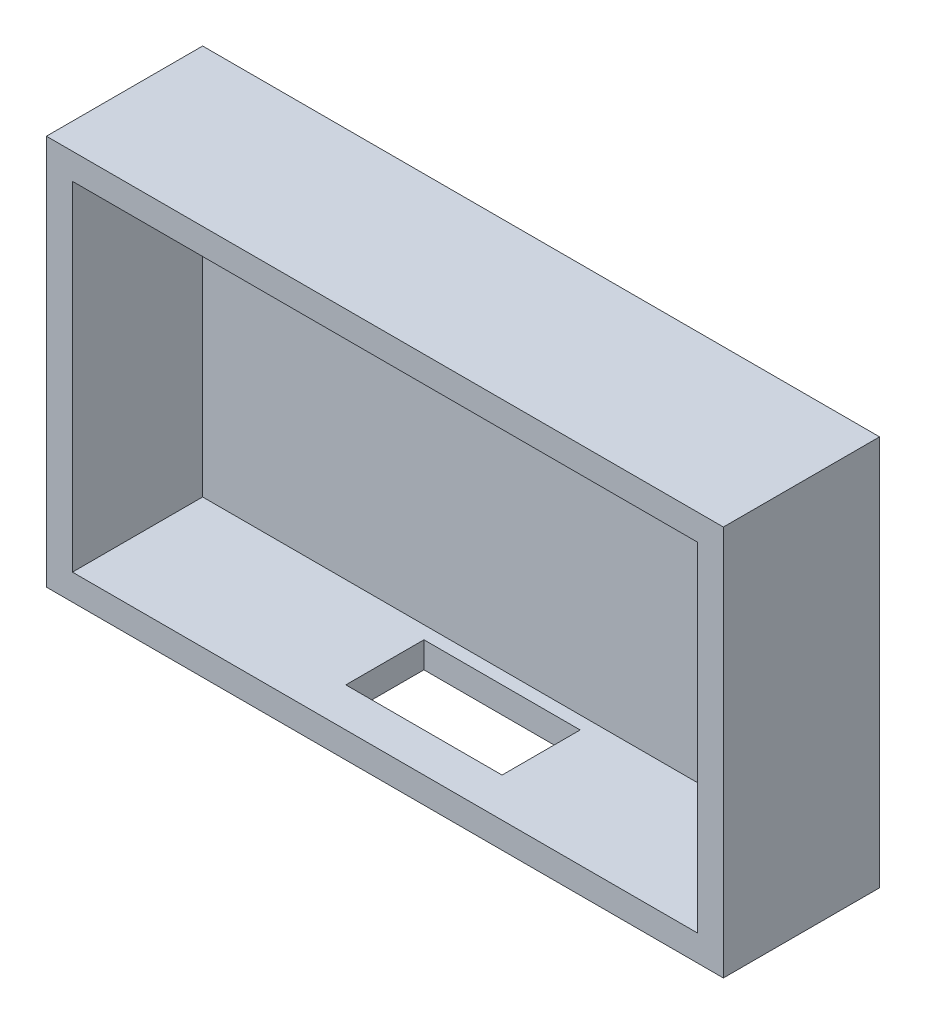
ISO-10303-21;
HEADER;
FILE_DESCRIPTION(('STEP AP214'),'2;1');
FILE_NAME('part.step','',(''),(''),'','','');
FILE_SCHEMA(('AUTOMOTIVE_DESIGN { 1 0 10303 214 1 1 1 1 }'));
ENDSEC;
DATA;
#1=APPLICATION_CONTEXT('core data for automotive mechanical design processes');
#2=APPLICATION_PROTOCOL_DEFINITION('international standard','automotive_design',2000,#1);
#3=PRODUCT_CONTEXT('',#1,'mechanical');
#4=PRODUCT('Part','Part','',(#3));
#5=PRODUCT_RELATED_PRODUCT_CATEGORY('part','',(#4));
#6=PRODUCT_DEFINITION_FORMATION('','',#4);
#7=PRODUCT_DEFINITION_CONTEXT('part definition',#1,'design');
#8=PRODUCT_DEFINITION('design','',#6,#7);
#9=PRODUCT_DEFINITION_SHAPE('','',#8);
#10=(LENGTH_UNIT() NAMED_UNIT(*) SI_UNIT(.MILLI.,.METRE.));
#11=(NAMED_UNIT(*) PLANE_ANGLE_UNIT() SI_UNIT($,.RADIAN.));
#12=(NAMED_UNIT(*) SI_UNIT($,.STERADIAN.) SOLID_ANGLE_UNIT());
#13=UNCERTAINTY_MEASURE_WITH_UNIT(LENGTH_MEASURE(1.E-05),#10,'distance_accuracy_value','');
#14=(GEOMETRIC_REPRESENTATION_CONTEXT(3) GLOBAL_UNCERTAINTY_ASSIGNED_CONTEXT((#13)) GLOBAL_UNIT_ASSIGNED_CONTEXT((#10,
#11,#12)) REPRESENTATION_CONTEXT('',''));
#15=CARTESIAN_POINT('',(0.,0.,0.));
#16=DIRECTION('',(0.,0.,1.));
#17=DIRECTION('',(1.,0.,0.));
#18=AXIS2_PLACEMENT_3D('',#15,#16,#17);
#19=CARTESIAN_POINT('',(0.,75.,0.));
#20=DIRECTION('',(0.,0.,-1.));
#21=DIRECTION('',(-1.,0.,0.));
#22=AXIS2_PLACEMENT_3D('',#19,#20,#21);
#23=PLANE('',#22);
#24=DIRECTION('',(1.,0.,0.));
#25=VECTOR('',#24,1.);
#26=CARTESIAN_POINT('',(0.,0.,0.));
#27=LINE('',#26,#25);
#28=CARTESIAN_POINT('',(0.,0.,0.));
#29=VERTEX_POINT('',#28);
#30=CARTESIAN_POINT('',(130.,0.,0.));
#31=VERTEX_POINT('',#30);
#32=EDGE_CURVE('E194',#29,#31,#27,.T.);
#33=ORIENTED_EDGE('',*,*,#32,.T.);
#34=DIRECTION('',(0.,-1.,0.));
#35=VECTOR('',#34,1.);
#36=CARTESIAN_POINT('',(130.,75.,0.));
#37=LINE('',#36,#35);
#38=CARTESIAN_POINT('',(130.,75.,0.));
#39=VERTEX_POINT('',#38);
#40=EDGE_CURVE('E40',#39,#31,#37,.T.);
#41=ORIENTED_EDGE('',*,*,#40,.F.);
#42=DIRECTION('',(1.,0.,0.));
#43=VECTOR('',#42,1.);
#44=CARTESIAN_POINT('',(0.,75.,0.));
#45=LINE('',#44,#43);
#46=CARTESIAN_POINT('',(0.,75.,0.));
#47=VERTEX_POINT('',#46);
#48=EDGE_CURVE('E184',#47,#39,#45,.T.);
#49=ORIENTED_EDGE('',*,*,#48,.F.);
#50=DIRECTION('',(0.,-1.,0.));
#51=VECTOR('',#50,1.);
#52=CARTESIAN_POINT('',(0.,75.,0.));
#53=LINE('',#52,#51);
#54=EDGE_CURVE('E11',#47,#29,#53,.T.);
#55=ORIENTED_EDGE('',*,*,#54,.T.);
#56=EDGE_LOOP('',(#33,#41,#49,#55));
#57=FACE_BOUND('',#56,.T.);
#58=DIRECTION('',(1.,0.,0.));
#59=VECTOR('',#58,1.);
#60=CARTESIAN_POINT('',(0.,5.,0.));
#61=LINE('',#60,#59);
#62=CARTESIAN_POINT('',(5.,5.,0.));
#63=VERTEX_POINT('',#62);
#64=CARTESIAN_POINT('',(125.,5.,0.));
#65=VERTEX_POINT('',#64);
#66=EDGE_CURVE('E154',#63,#65,#61,.T.);
#67=ORIENTED_EDGE('',*,*,#66,.F.);
#68=DIRECTION('',(0.,-1.,0.));
#69=VECTOR('',#68,1.);
#70=CARTESIAN_POINT('',(5.,75.,0.));
#71=LINE('',#70,#69);
#72=CARTESIAN_POINT('',(5.,70.,0.));
#73=VERTEX_POINT('',#72);
#74=EDGE_CURVE('E173',#73,#63,#71,.T.);
#75=ORIENTED_EDGE('',*,*,#74,.F.);
#76=DIRECTION('',(1.,0.,0.));
#77=VECTOR('',#76,1.);
#78=CARTESIAN_POINT('',(0.,70.,0.));
#79=LINE('',#78,#77);
#80=CARTESIAN_POINT('',(125.,70.,0.));
#81=VERTEX_POINT('',#80);
#82=EDGE_CURVE('E157',#73,#81,#79,.T.);
#83=ORIENTED_EDGE('',*,*,#82,.T.);
#84=DIRECTION('',(0.,-1.,0.));
#85=VECTOR('',#84,1.);
#86=CARTESIAN_POINT('',(125.,75.,0.));
#87=LINE('',#86,#85);
#88=EDGE_CURVE('E170',#81,#65,#87,.T.);
#89=ORIENTED_EDGE('',*,*,#88,.T.);
#90=EDGE_LOOP('',(#67,#75,#83,#89));
#91=FACE_BOUND('',#90,.T.);
#92=ADVANCED_FACE('F32',(#57,#91),#23,.F.);
#93=CARTESIAN_POINT('',(0.,75.,0.));
#94=DIRECTION('',(1.,0.,0.));
#95=DIRECTION('',(0.,0.,-1.));
#96=AXIS2_PLACEMENT_3D('',#93,#94,#95);
#97=PLANE('',#96);
#98=DIRECTION('',(0.,0.,1.));
#99=VECTOR('',#98,1.);
#100=CARTESIAN_POINT('',(0.,0.,0.));
#101=LINE('',#100,#99);
#102=CARTESIAN_POINT('',(0.,0.,-30.));
#103=VERTEX_POINT('',#102);
#104=EDGE_CURVE('E175',#103,#29,#101,.T.);
#105=ORIENTED_EDGE('',*,*,#104,.T.);
#106=ORIENTED_EDGE('',*,*,#54,.F.);
#107=DIRECTION('',(0.,0.,1.));
#108=VECTOR('',#107,1.);
#109=CARTESIAN_POINT('',(0.,75.,0.));
#110=LINE('',#109,#108);
#111=CARTESIAN_POINT('',(0.,75.,-30.));
#112=VERTEX_POINT('',#111);
#113=EDGE_CURVE('E181',#112,#47,#110,.T.);
#114=ORIENTED_EDGE('',*,*,#113,.F.);
#115=DIRECTION('',(0.,-1.,0.));
#116=VECTOR('',#115,1.);
#117=CARTESIAN_POINT('',(0.,75.,-30.));
#118=LINE('',#117,#116);
#119=EDGE_CURVE('E191',#112,#103,#118,.T.);
#120=ORIENTED_EDGE('',*,*,#119,.T.);
#121=EDGE_LOOP('',(#105,#106,#114,#120));
#122=FACE_BOUND('',#121,.T.);
#123=ADVANCED_FACE('F34',(#122),#97,.F.);
#124=CARTESIAN_POINT('',(130.,75.,0.));
#125=DIRECTION('',(-1.,0.,0.));
#126=DIRECTION('',(0.,0.,1.));
#127=AXIS2_PLACEMENT_3D('',#124,#125,#126);
#128=PLANE('',#127);
#129=DIRECTION('',(0.,0.,-1.));
#130=VECTOR('',#129,1.);
#131=CARTESIAN_POINT('',(130.,0.,0.));
#132=LINE('',#131,#130);
#133=CARTESIAN_POINT('',(130.,0.,-30.));
#134=VERTEX_POINT('',#133);
#135=EDGE_CURVE('E196',#31,#134,#132,.T.);
#136=ORIENTED_EDGE('',*,*,#135,.T.);
#137=DIRECTION('',(0.,-1.,0.));
#138=VECTOR('',#137,1.);
#139=CARTESIAN_POINT('',(130.,75.,-30.));
#140=LINE('',#139,#138);
#141=CARTESIAN_POINT('',(130.,75.,-30.));
#142=VERTEX_POINT('',#141);
#143=EDGE_CURVE('E201',#142,#134,#140,.T.);
#144=ORIENTED_EDGE('',*,*,#143,.F.);
#145=DIRECTION('',(0.,0.,-1.));
#146=VECTOR('',#145,1.);
#147=CARTESIAN_POINT('',(130.,75.,0.));
#148=LINE('',#147,#146);
#149=EDGE_CURVE('E187',#39,#142,#148,.T.);
#150=ORIENTED_EDGE('',*,*,#149,.F.);
#151=ORIENTED_EDGE('',*,*,#40,.T.);
#152=EDGE_LOOP('',(#136,#144,#150,#151));
#153=FACE_BOUND('',#152,.T.);
#154=ADVANCED_FACE('F208',(#153),#128,.F.);
#155=CARTESIAN_POINT('',(0.,75.,-30.));
#156=DIRECTION('',(0.,0.,1.));
#157=DIRECTION('',(1.,0.,0.));
#158=AXIS2_PLACEMENT_3D('',#155,#156,#157);
#159=PLANE('',#158);
#160=DIRECTION('',(-1.,0.,0.));
#161=VECTOR('',#160,1.);
#162=CARTESIAN_POINT('',(0.,0.,-30.));
#163=LINE('',#162,#161);
#164=EDGE_CURVE('E185',#134,#103,#163,.T.);
#165=ORIENTED_EDGE('',*,*,#164,.T.);
#166=ORIENTED_EDGE('',*,*,#119,.F.);
#167=DIRECTION('',(-1.,0.,0.));
#168=VECTOR('',#167,1.);
#169=CARTESIAN_POINT('',(0.,75.,-30.));
#170=LINE('',#169,#168);
#171=EDGE_CURVE('E189',#142,#112,#170,.T.);
#172=ORIENTED_EDGE('',*,*,#171,.F.);
#173=ORIENTED_EDGE('',*,*,#143,.T.);
#174=EDGE_LOOP('',(#165,#166,#172,#173));
#175=FACE_BOUND('',#174,.T.);
#176=ADVANCED_FACE('F215',(#175),#159,.F.);
#177=CARTESIAN_POINT('',(0.,75.,0.));
#178=DIRECTION('',(0.,-1.,0.));
#179=DIRECTION('',(0.,0.,-1.));
#180=AXIS2_PLACEMENT_3D('',#177,#178,#179);
#181=PLANE('',#180);
#182=ORIENTED_EDGE('',*,*,#113,.T.);
#183=ORIENTED_EDGE('',*,*,#48,.T.);
#184=ORIENTED_EDGE('',*,*,#149,.T.);
#185=ORIENTED_EDGE('',*,*,#171,.T.);
#186=EDGE_LOOP('',(#182,#183,#184,#185));
#187=FACE_BOUND('',#186,.T.);
#188=ADVANCED_FACE('F221',(#187),#181,.F.);
#189=CARTESIAN_POINT('',(0.,0.,0.));
#190=DIRECTION('',(0.,-1.,0.));
#191=DIRECTION('',(0.,0.,-1.));
#192=AXIS2_PLACEMENT_3D('',#189,#190,#191);
#193=PLANE('',#192);
#194=DIRECTION('',(-1.,0.,0.));
#195=VECTOR('',#194,1.);
#196=CARTESIAN_POINT('',(50.,0.,-7.5));
#197=LINE('',#196,#195);
#198=CARTESIAN_POINT('',(80.,0.,-7.5));
#199=VERTEX_POINT('',#198);
#200=CARTESIAN_POINT('',(50.,0.,-7.5));
#201=VERTEX_POINT('',#200);
#202=EDGE_CURVE('E123',#199,#201,#197,.T.);
#203=ORIENTED_EDGE('',*,*,#202,.F.);
#204=DIRECTION('',(0.,0.,1.));
#205=VECTOR('',#204,1.);
#206=CARTESIAN_POINT('',(80.,0.,-22.5));
#207=LINE('',#206,#205);
#208=CARTESIAN_POINT('',(80.,0.,-22.5));
#209=VERTEX_POINT('',#208);
#210=EDGE_CURVE('E131',#209,#199,#207,.T.);
#211=ORIENTED_EDGE('',*,*,#210,.F.);
#212=DIRECTION('',(1.,0.,0.));
#213=VECTOR('',#212,1.);
#214=CARTESIAN_POINT('',(50.,0.,-22.5));
#215=LINE('',#214,#213);
#216=CARTESIAN_POINT('',(50.,0.,-22.5));
#217=VERTEX_POINT('',#216);
#218=EDGE_CURVE('E47',#217,#209,#215,.T.);
#219=ORIENTED_EDGE('',*,*,#218,.F.);
#220=DIRECTION('',(0.,0.,-1.));
#221=VECTOR('',#220,1.);
#222=CARTESIAN_POINT('',(50.,0.,-22.5));
#223=LINE('',#222,#221);
#224=EDGE_CURVE('E140',#201,#217,#223,.T.);
#225=ORIENTED_EDGE('',*,*,#224,.F.);
#226=EDGE_LOOP('',(#203,#211,#219,#225));
#227=FACE_BOUND('',#226,.T.);
#228=ORIENTED_EDGE('',*,*,#104,.F.);
#229=ORIENTED_EDGE('',*,*,#164,.F.);
#230=ORIENTED_EDGE('',*,*,#135,.F.);
#231=ORIENTED_EDGE('',*,*,#32,.F.);
#232=EDGE_LOOP('',(#228,#229,#230,#231));
#233=FACE_BOUND('',#232,.T.);
#234=ADVANCED_FACE('F137',(#227,#233),#193,.T.);
#235=CARTESIAN_POINT('',(5.,75.,0.));
#236=DIRECTION('',(1.,0.,0.));
#237=DIRECTION('',(0.,0.,-1.));
#238=AXIS2_PLACEMENT_3D('',#235,#236,#237);
#239=PLANE('',#238);
#240=DIRECTION('',(0.,0.,1.));
#241=VECTOR('',#240,1.);
#242=CARTESIAN_POINT('',(5.,5.,0.));
#243=LINE('',#242,#241);
#244=CARTESIAN_POINT('',(5.,5.,-25.));
#245=VERTEX_POINT('',#244);
#246=EDGE_CURVE('E151',#245,#63,#243,.T.);
#247=ORIENTED_EDGE('',*,*,#246,.F.);
#248=DIRECTION('',(0.,-1.,0.));
#249=VECTOR('',#248,1.);
#250=CARTESIAN_POINT('',(5.,75.,-25.));
#251=LINE('',#250,#249);
#252=CARTESIAN_POINT('',(5.,70.,-25.));
#253=VERTEX_POINT('',#252);
#254=EDGE_CURVE('E159',#253,#245,#251,.T.);
#255=ORIENTED_EDGE('',*,*,#254,.F.);
#256=DIRECTION('',(0.,0.,1.));
#257=VECTOR('',#256,1.);
#258=CARTESIAN_POINT('',(5.,70.,0.));
#259=LINE('',#258,#257);
#260=EDGE_CURVE('E155',#253,#73,#259,.T.);
#261=ORIENTED_EDGE('',*,*,#260,.T.);
#262=ORIENTED_EDGE('',*,*,#74,.T.);
#263=EDGE_LOOP('',(#247,#255,#261,#262));
#264=FACE_BOUND('',#263,.T.);
#265=ADVANCED_FACE('F241',(#264),#239,.T.);
#266=CARTESIAN_POINT('',(125.,75.,0.));
#267=DIRECTION('',(-1.,0.,0.));
#268=DIRECTION('',(0.,0.,1.));
#269=AXIS2_PLACEMENT_3D('',#266,#267,#268);
#270=PLANE('',#269);
#271=DIRECTION('',(0.,0.,-1.));
#272=VECTOR('',#271,1.);
#273=CARTESIAN_POINT('',(125.,5.,0.));
#274=LINE('',#273,#272);
#275=CARTESIAN_POINT('',(125.,5.,-25.));
#276=VERTEX_POINT('',#275);
#277=EDGE_CURVE('E165',#65,#276,#274,.T.);
#278=ORIENTED_EDGE('',*,*,#277,.F.);
#279=ORIENTED_EDGE('',*,*,#88,.F.);
#280=DIRECTION('',(0.,0.,-1.));
#281=VECTOR('',#280,1.);
#282=CARTESIAN_POINT('',(125.,70.,0.));
#283=LINE('',#282,#281);
#284=CARTESIAN_POINT('',(125.,70.,-25.));
#285=VERTEX_POINT('',#284);
#286=EDGE_CURVE('E167',#81,#285,#283,.T.);
#287=ORIENTED_EDGE('',*,*,#286,.T.);
#288=DIRECTION('',(0.,-1.,0.));
#289=VECTOR('',#288,1.);
#290=CARTESIAN_POINT('',(125.,75.,-25.));
#291=LINE('',#290,#289);
#292=EDGE_CURVE('E162',#285,#276,#291,.T.);
#293=ORIENTED_EDGE('',*,*,#292,.T.);
#294=EDGE_LOOP('',(#278,#279,#287,#293));
#295=FACE_BOUND('',#294,.T.);
#296=ADVANCED_FACE('F231',(#295),#270,.T.);
#297=CARTESIAN_POINT('',(0.,75.,-25.));
#298=DIRECTION('',(0.,0.,1.));
#299=DIRECTION('',(1.,0.,0.));
#300=AXIS2_PLACEMENT_3D('',#297,#298,#299);
#301=PLANE('',#300);
#302=DIRECTION('',(-1.,0.,0.));
#303=VECTOR('',#302,1.);
#304=CARTESIAN_POINT('',(0.,5.,-25.));
#305=LINE('',#304,#303);
#306=EDGE_CURVE('E158',#276,#245,#305,.T.);
#307=ORIENTED_EDGE('',*,*,#306,.F.);
#308=ORIENTED_EDGE('',*,*,#292,.F.);
#309=DIRECTION('',(-1.,0.,0.));
#310=VECTOR('',#309,1.);
#311=CARTESIAN_POINT('',(0.,70.,-25.));
#312=LINE('',#311,#310);
#313=EDGE_CURVE('E163',#285,#253,#312,.T.);
#314=ORIENTED_EDGE('',*,*,#313,.T.);
#315=ORIENTED_EDGE('',*,*,#254,.T.);
#316=EDGE_LOOP('',(#307,#308,#314,#315));
#317=FACE_BOUND('',#316,.T.);
#318=ADVANCED_FACE('F237',(#317),#301,.T.);
#319=CARTESIAN_POINT('',(0.,70.,0.));
#320=DIRECTION('',(0.,-1.,0.));
#321=DIRECTION('',(0.,0.,-1.));
#322=AXIS2_PLACEMENT_3D('',#319,#320,#321);
#323=PLANE('',#322);
#324=ORIENTED_EDGE('',*,*,#260,.F.);
#325=ORIENTED_EDGE('',*,*,#313,.F.);
#326=ORIENTED_EDGE('',*,*,#286,.F.);
#327=ORIENTED_EDGE('',*,*,#82,.F.);
#328=EDGE_LOOP('',(#324,#325,#326,#327));
#329=FACE_BOUND('',#328,.T.);
#330=ADVANCED_FACE('F244',(#329),#323,.T.);
#331=CARTESIAN_POINT('',(0.,5.,0.));
#332=DIRECTION('',(0.,-1.,0.));
#333=DIRECTION('',(0.,0.,-1.));
#334=AXIS2_PLACEMENT_3D('',#331,#332,#333);
#335=PLANE('',#334);
#336=DIRECTION('',(0.,0.,-1.));
#337=VECTOR('',#336,1.);
#338=CARTESIAN_POINT('',(80.,5.,-22.5));
#339=LINE('',#338,#337);
#340=CARTESIAN_POINT('',(80.,5.,-7.5));
#341=VERTEX_POINT('',#340);
#342=CARTESIAN_POINT('',(80.,5.,-22.5));
#343=VERTEX_POINT('',#342);
#344=EDGE_CURVE('E135',#341,#343,#339,.T.);
#345=ORIENTED_EDGE('',*,*,#344,.F.);
#346=DIRECTION('',(1.,0.,0.));
#347=VECTOR('',#346,1.);
#348=CARTESIAN_POINT('',(50.,5.,-7.5));
#349=LINE('',#348,#347);
#350=CARTESIAN_POINT('',(50.,5.,-7.5));
#351=VERTEX_POINT('',#350);
#352=EDGE_CURVE('E55',#351,#341,#349,.T.);
#353=ORIENTED_EDGE('',*,*,#352,.F.);
#354=DIRECTION('',(0.,0.,1.));
#355=VECTOR('',#354,1.);
#356=CARTESIAN_POINT('',(50.,5.,-22.5));
#357=LINE('',#356,#355);
#358=CARTESIAN_POINT('',(50.,5.,-22.5));
#359=VERTEX_POINT('',#358);
#360=EDGE_CURVE('E356',#359,#351,#357,.T.);
#361=ORIENTED_EDGE('',*,*,#360,.F.);
#362=DIRECTION('',(-1.,0.,0.));
#363=VECTOR('',#362,1.);
#364=CARTESIAN_POINT('',(50.,5.,-22.5));
#365=LINE('',#364,#363);
#366=EDGE_CURVE('E354',#343,#359,#365,.T.);
#367=ORIENTED_EDGE('',*,*,#366,.F.);
#368=EDGE_LOOP('',(#345,#353,#361,#367));
#369=FACE_BOUND('',#368,.T.);
#370=ORIENTED_EDGE('',*,*,#246,.T.);
#371=ORIENTED_EDGE('',*,*,#66,.T.);
#372=ORIENTED_EDGE('',*,*,#277,.T.);
#373=ORIENTED_EDGE('',*,*,#306,.T.);
#374=EDGE_LOOP('',(#370,#371,#372,#373));
#375=FACE_BOUND('',#374,.T.);
#376=ADVANCED_FACE('F228',(#369,#375),#335,.F.);
#377=CARTESIAN_POINT('',(50.,75.001,-7.5));
#378=DIRECTION('',(0.,0.,1.));
#379=DIRECTION('',(1.,0.,0.));
#380=AXIS2_PLACEMENT_3D('',#377,#378,#379);
#381=PLANE('',#380);
#382=ORIENTED_EDGE('',*,*,#352,.T.);
#383=DIRECTION('',(0.,-1.,0.));
#384=VECTOR('',#383,1.);
#385=CARTESIAN_POINT('',(80.,75.001,-7.5));
#386=LINE('',#385,#384);
#387=EDGE_CURVE('E119',#341,#199,#386,.T.);
#388=ORIENTED_EDGE('',*,*,#387,.T.);
#389=ORIENTED_EDGE('',*,*,#202,.T.);
#390=DIRECTION('',(0.,-1.,0.));
#391=VECTOR('',#390,1.);
#392=CARTESIAN_POINT('',(50.,75.001,-7.5));
#393=LINE('',#392,#391);
#394=EDGE_CURVE('E128',#351,#201,#393,.T.);
#395=ORIENTED_EDGE('',*,*,#394,.F.);
#396=EDGE_LOOP('',(#382,#388,#389,#395));
#397=FACE_BOUND('',#396,.T.);
#398=ADVANCED_FACE('F121',(#397),#381,.F.);
#399=CARTESIAN_POINT('',(50.,75.001,-22.5));
#400=DIRECTION('',(-1.,0.,0.));
#401=DIRECTION('',(0.,0.,1.));
#402=AXIS2_PLACEMENT_3D('',#399,#400,#401);
#403=PLANE('',#402);
#404=ORIENTED_EDGE('',*,*,#360,.T.);
#405=ORIENTED_EDGE('',*,*,#394,.T.);
#406=ORIENTED_EDGE('',*,*,#224,.T.);
#407=DIRECTION('',(0.,-1.,0.));
#408=VECTOR('',#407,1.);
#409=CARTESIAN_POINT('',(50.,75.001,-22.5));
#410=LINE('',#409,#408);
#411=EDGE_CURVE('E147',#359,#217,#410,.T.);
#412=ORIENTED_EDGE('',*,*,#411,.F.);
#413=EDGE_LOOP('',(#404,#405,#406,#412));
#414=FACE_BOUND('',#413,.T.);
#415=ADVANCED_FACE('F322',(#414),#403,.F.);
#416=CARTESIAN_POINT('',(50.,75.001,-22.5));
#417=DIRECTION('',(0.,0.,-1.));
#418=DIRECTION('',(-1.,0.,0.));
#419=AXIS2_PLACEMENT_3D('',#416,#417,#418);
#420=PLANE('',#419);
#421=ORIENTED_EDGE('',*,*,#366,.T.);
#422=ORIENTED_EDGE('',*,*,#411,.T.);
#423=ORIENTED_EDGE('',*,*,#218,.T.);
#424=DIRECTION('',(0.,-1.,0.));
#425=VECTOR('',#424,1.);
#426=CARTESIAN_POINT('',(80.,75.001,-22.5));
#427=LINE('',#426,#425);
#428=EDGE_CURVE('E133',#343,#209,#427,.T.);
#429=ORIENTED_EDGE('',*,*,#428,.F.);
#430=EDGE_LOOP('',(#421,#422,#423,#429));
#431=FACE_BOUND('',#430,.T.);
#432=ADVANCED_FACE('F331',(#431),#420,.F.);
#433=CARTESIAN_POINT('',(80.,75.001,-22.5));
#434=DIRECTION('',(1.,0.,0.));
#435=DIRECTION('',(0.,0.,-1.));
#436=AXIS2_PLACEMENT_3D('',#433,#434,#435);
#437=PLANE('',#436);
#438=ORIENTED_EDGE('',*,*,#344,.T.);
#439=ORIENTED_EDGE('',*,*,#428,.T.);
#440=ORIENTED_EDGE('',*,*,#210,.T.);
#441=ORIENTED_EDGE('',*,*,#387,.F.);
#442=EDGE_LOOP('',(#438,#439,#440,#441));
#443=FACE_BOUND('',#442,.T.);
#444=ADVANCED_FACE('F132',(#443),#437,.F.);
#445=CLOSED_SHELL('',(#92,#123,#154,#176,#188,#234,#265,#296,#318,#330,#376,#398,#415,#432,#444));
#446=MANIFOLD_SOLID_BREP('B2',#445);
#447=ADVANCED_BREP_SHAPE_REPRESENTATION('',(#18,#446),#14);
#448=SHAPE_DEFINITION_REPRESENTATION(#9,#447);
ENDSEC;
END-ISO-10303-21;
